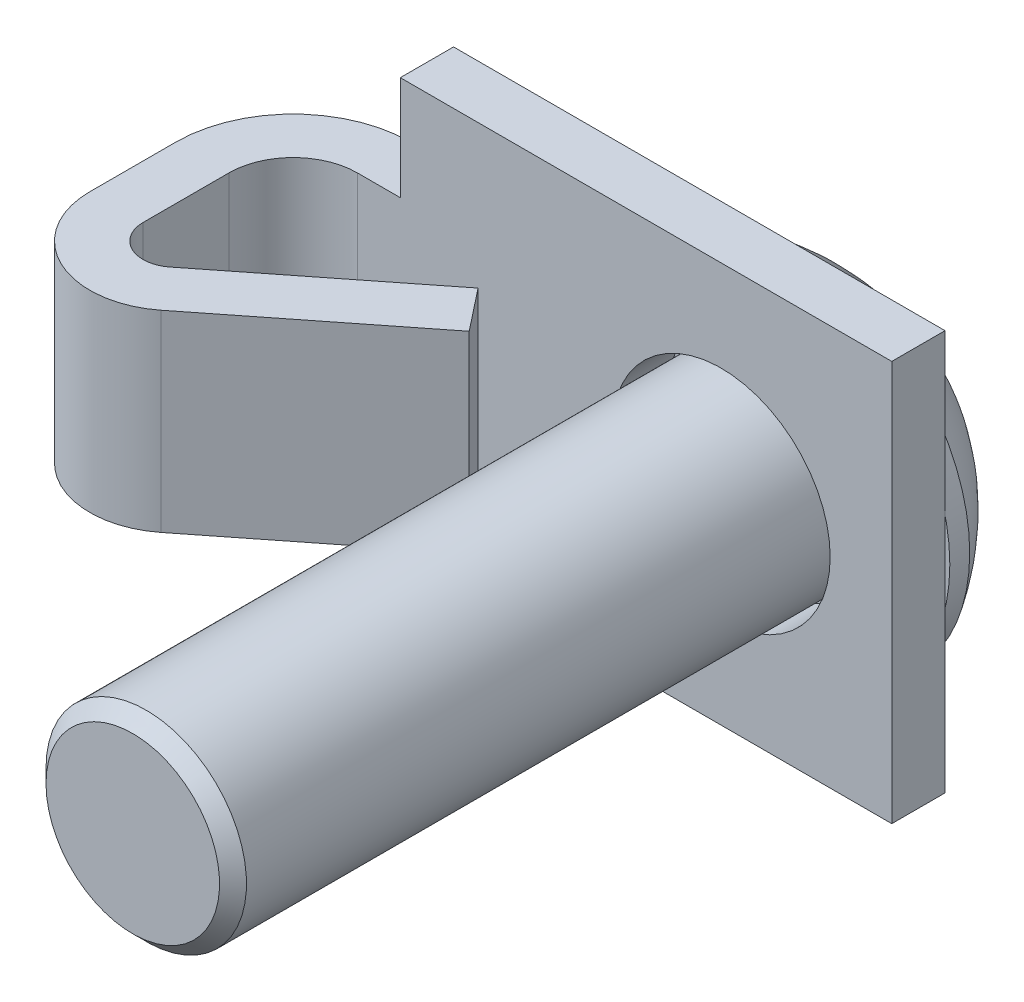
ISO-10303-21;
HEADER;
FILE_DESCRIPTION(('STEP AP214'),'2;1');
FILE_NAME('part.step','',(''),(''),'','','');
FILE_SCHEMA(('AUTOMOTIVE_DESIGN { 1 0 10303 214 1 1 1 1 }'));
ENDSEC;
DATA;
#1=APPLICATION_CONTEXT('core data for automotive mechanical design processes');
#2=APPLICATION_PROTOCOL_DEFINITION('international standard','automotive_design',2000,#1);
#3=PRODUCT_CONTEXT('',#1,'mechanical');
#4=PRODUCT('Part','Part','',(#3));
#5=PRODUCT_RELATED_PRODUCT_CATEGORY('part','',(#4));
#6=PRODUCT_DEFINITION_FORMATION('','',#4);
#7=PRODUCT_DEFINITION_CONTEXT('part definition',#1,'design');
#8=PRODUCT_DEFINITION('design','',#6,#7);
#9=PRODUCT_DEFINITION_SHAPE('','',#8);
#10=(LENGTH_UNIT() NAMED_UNIT(*) SI_UNIT(.MILLI.,.METRE.));
#11=(NAMED_UNIT(*) PLANE_ANGLE_UNIT() SI_UNIT($,.RADIAN.));
#12=(NAMED_UNIT(*) SI_UNIT($,.STERADIAN.) SOLID_ANGLE_UNIT());
#13=UNCERTAINTY_MEASURE_WITH_UNIT(LENGTH_MEASURE(1.E-05),#10,'distance_accuracy_value','');
#14=(GEOMETRIC_REPRESENTATION_CONTEXT(3) GLOBAL_UNCERTAINTY_ASSIGNED_CONTEXT((#13)) GLOBAL_UNIT_ASSIGNED_CONTEXT((#10,
#11,#12)) REPRESENTATION_CONTEXT('',''));
#15=CARTESIAN_POINT('',(0.,0.,0.));
#16=DIRECTION('',(0.,0.,1.));
#17=DIRECTION('',(1.,0.,0.));
#18=AXIS2_PLACEMENT_3D('',#15,#16,#17);
#19=CARTESIAN_POINT('',(-19.9497583249162,11.2575197282908,-2.39884763956345));
#20=DIRECTION('',(0.,1.,0.));
#21=DIRECTION('',(0.,0.,1.));
#22=AXIS2_PLACEMENT_3D('',#19,#20,#21);
#23=CYLINDRICAL_SURFACE('',#22,1.27);
#24=CARTESIAN_POINT('',(-19.9497583249162,11.2575197282908,-2.39884763956345));
#25=DIRECTION('',(0.,1.,0.));
#26=DIRECTION('',(0.,0.,1.));
#27=AXIS2_PLACEMENT_3D('',#24,#25,#26);
#28=CIRCLE('',#27,1.27);
#29=CARTESIAN_POINT('',(-21.2197583249162,11.2575197282908,-2.39884763956345));
#30=VERTEX_POINT('',#29);
#31=CARTESIAN_POINT('',(-19.1634522293389,11.2575197282908,-1.40153990167204));
#32=VERTEX_POINT('',#31);
#33=EDGE_CURVE('P0_E139',#30,#32,#28,.T.);
#34=ORIENTED_EDGE('',*,*,#33,.F.);
#35=DIRECTION('',(0.,-1.,0.));
#36=VECTOR('',#35,1.);
#37=CARTESIAN_POINT('',(-21.2197583249162,18.8775197282907,-2.3988476395634));
#38=LINE('',#37,#36);
#39=CARTESIAN_POINT('',(-21.2197583249162,18.8775197282907,-2.39884763956339));
#40=VERTEX_POINT('',#39);
#41=EDGE_CURVE('P0_E164',#40,#30,#38,.T.);
#42=ORIENTED_EDGE('',*,*,#41,.F.);
#43=CARTESIAN_POINT('',(-19.9497583249162,18.8775197282907,-2.3988476395634));
#44=DIRECTION('',(0.,1.,0.));
#45=DIRECTION('',(0.,0.,1.));
#46=AXIS2_PLACEMENT_3D('',#43,#44,#45);
#47=CIRCLE('',#46,1.27);
#48=CARTESIAN_POINT('',(-19.1634522293389,18.8775197282907,-1.40153990167199));
#49=VERTEX_POINT('',#48);
#50=EDGE_CURVE('P0_E171',#49,#40,#47,.F.);
#51=ORIENTED_EDGE('',*,*,#50,.F.);
#52=DIRECTION('',(0.,1.,0.));
#53=VECTOR('',#52,1.);
#54=CARTESIAN_POINT('',(-19.1634522293389,11.2575197282908,-1.40153990167204));
#55=LINE('',#54,#53);
#56=EDGE_CURVE('P0_E20',#32,#49,#55,.T.);
#57=ORIENTED_EDGE('',*,*,#56,.F.);
#58=EDGE_LOOP('',(#34,#42,#51,#57));
#59=FACE_BOUND('',#58,.T.);
#60=ADVANCED_FACE('P0_F16',(#59),#23,.F.);
#61=CARTESIAN_POINT('',(-19.1634522293389,11.2575197282908,-1.40153990167204));
#62=DIRECTION('',(-0.619138657934842,0.,-0.785281683379055));
#63=DIRECTION('',(0.,1.,0.));
#64=AXIS2_PLACEMENT_3D('',#61,#62,#63);
#65=PLANE('',#64);
#66=DIRECTION('',(0.785281683379055,0.,-0.619138657934842));
#67=VECTOR('',#66,1.);
#68=CARTESIAN_POINT('',(-19.1634522293389,11.2575197282908,-1.40153990167204));
#69=LINE('',#68,#67);
#70=CARTESIAN_POINT('',(-12.3396264435744,11.2575197282908,-6.78164035276085));
#71=VERTEX_POINT('',#70);
#72=EDGE_CURVE('P0_E130',#32,#71,#69,.T.);
#73=ORIENTED_EDGE('',*,*,#72,.F.);
#74=ORIENTED_EDGE('',*,*,#56,.T.);
#75=DIRECTION('',(-0.785281683379055,0.,0.619138657934842));
#76=VECTOR('',#75,1.);
#77=CARTESIAN_POINT('',(-12.3396264435744,18.8775197282908,-6.7816403527608));
#78=LINE('',#77,#76);
#79=CARTESIAN_POINT('',(-12.3396264435744,18.8775197282908,-6.7816403527608));
#80=VERTEX_POINT('',#79);
#81=EDGE_CURVE('P0_E146',#80,#49,#78,.T.);
#82=ORIENTED_EDGE('',*,*,#81,.F.);
#83=DIRECTION('',(0.,-1.,0.));
#84=VECTOR('',#83,1.);
#85=CARTESIAN_POINT('',(-12.3396264435744,18.8775197282908,-6.7816403527608));
#86=LINE('',#85,#84);
#87=EDGE_CURVE('P0_E143',#71,#80,#86,.F.);
#88=ORIENTED_EDGE('',*,*,#87,.F.);
#89=EDGE_LOOP('',(#73,#74,#82,#88));
#90=FACE_BOUND('',#89,.T.);
#91=ADVANCED_FACE('P0_F144',(#90),#65,.T.);
#92=CARTESIAN_POINT('',(-11.0343583249162,18.8775197282908,-5.12610950786104));
#93=DIRECTION('',(0.785281683379066,0.,-0.619138657934828));
#94=DIRECTION('',(0.,-1.,0.));
#95=AXIS2_PLACEMENT_3D('',#92,#93,#94);
#96=PLANE('',#95);
#97=DIRECTION('',(0.619138657934827,0.,0.785281683379066));
#98=VECTOR('',#97,1.);
#99=CARTESIAN_POINT('',(-12.3396264435744,11.2575197282908,-6.78164035276084));
#100=LINE('',#99,#98);
#101=CARTESIAN_POINT('',(-11.0343583249162,11.2575197282908,-5.12610950786109));
#102=VERTEX_POINT('',#101);
#103=EDGE_CURVE('P0_E135',#71,#102,#100,.T.);
#104=ORIENTED_EDGE('',*,*,#103,.F.);
#105=ORIENTED_EDGE('',*,*,#87,.T.);
#106=DIRECTION('',(-0.619138657934828,0.,-0.785281683379066));
#107=VECTOR('',#106,1.);
#108=CARTESIAN_POINT('',(-11.0343583249162,18.8775197282908,-5.12610950786104));
#109=LINE('',#108,#107);
#110=CARTESIAN_POINT('',(-11.0343583249162,18.8775197282908,-5.12610950786104));
#111=VERTEX_POINT('',#110);
#112=EDGE_CURVE('P0_E174',#111,#80,#109,.T.);
#113=ORIENTED_EDGE('',*,*,#112,.F.);
#114=DIRECTION('',(0.,-1.,0.));
#115=VECTOR('',#114,1.);
#116=CARTESIAN_POINT('',(-11.0343583249162,18.8775197282908,-5.12610950786104));
#117=LINE('',#116,#115);
#118=EDGE_CURVE('P0_E150',#102,#111,#117,.F.);
#119=ORIENTED_EDGE('',*,*,#118,.F.);
#120=EDGE_LOOP('',(#104,#105,#113,#119));
#121=FACE_BOUND('',#120,.T.);
#122=ADVANCED_FACE('P0_F151',(#121),#96,.T.);
#123=CARTESIAN_POINT('',(-17.8581841106807,18.8775197282907,0.253990943227745));
#124=DIRECTION('',(0.619138657934841,0.,0.785281683379056));
#125=DIRECTION('',(0.,-1.,0.));
#126=AXIS2_PLACEMENT_3D('',#123,#124,#125);
#127=PLANE('',#126);
#128=DIRECTION('',(-0.785281683379056,0.,0.619138657934841));
#129=VECTOR('',#128,1.);
#130=CARTESIAN_POINT('',(-11.0343583249162,11.2575197282908,-5.12610950786109));
#131=LINE('',#130,#129);
#132=CARTESIAN_POINT('',(-17.8581841106807,11.2575197282908,0.253990943227686));
#133=VERTEX_POINT('',#132);
#134=EDGE_CURVE('P0_E153',#102,#133,#131,.T.);
#135=ORIENTED_EDGE('',*,*,#134,.F.);
#136=ORIENTED_EDGE('',*,*,#118,.T.);
#137=DIRECTION('',(0.785281683379056,0.,-0.619138657934841));
#138=VECTOR('',#137,1.);
#139=CARTESIAN_POINT('',(-17.8581841106807,18.8775197282907,0.253990943227743));
#140=LINE('',#139,#138);
#141=CARTESIAN_POINT('',(-17.8581841106807,18.8775197282907,0.253990943227738));
#142=VERTEX_POINT('',#141);
#143=EDGE_CURVE('P0_E176',#142,#111,#140,.T.);
#144=ORIENTED_EDGE('',*,*,#143,.F.);
#145=DIRECTION('',(0.,-1.,0.));
#146=VECTOR('',#145,1.);
#147=CARTESIAN_POINT('',(-17.8581841106807,18.8775197282907,0.253990943227731));
#148=LINE('',#147,#146);
#149=EDGE_CURVE('P0_E189',#133,#142,#148,.F.);
#150=ORIENTED_EDGE('',*,*,#149,.F.);
#151=EDGE_LOOP('',(#135,#136,#144,#150));
#152=FACE_BOUND('',#151,.T.);
#153=ADVANCED_FACE('P0_F193',(#152),#127,.T.);
#154=CARTESIAN_POINT('',(-19.9497583249162,18.8775197282907,-2.3988476395634));
#155=DIRECTION('',(0.,-1.,0.));
#156=DIRECTION('',(0.,0.,-1.));
#157=AXIS2_PLACEMENT_3D('',#154,#155,#156);
#158=CYLINDRICAL_SURFACE('',#157,3.3782);
#159=CARTESIAN_POINT('',(-19.9497583249162,11.2575197282908,-2.39884763956345));
#160=DIRECTION('',(0.,-1.,0.));
#161=DIRECTION('',(0.,0.,-1.));
#162=AXIS2_PLACEMENT_3D('',#159,#160,#161);
#163=CIRCLE('',#162,3.3782);
#164=CARTESIAN_POINT('',(-23.3279583249162,11.2575197282908,-2.39884763956345));
#165=VERTEX_POINT('',#164);
#166=EDGE_CURVE('P0_E155',#133,#165,#163,.T.);
#167=ORIENTED_EDGE('',*,*,#166,.F.);
#168=ORIENTED_EDGE('',*,*,#149,.T.);
#169=CARTESIAN_POINT('',(-19.9497583249162,18.8775197282907,-2.3988476395634));
#170=DIRECTION('',(0.,-1.,0.));
#171=DIRECTION('',(0.,0.,-1.));
#172=AXIS2_PLACEMENT_3D('',#169,#170,#171);
#173=CIRCLE('',#172,3.3782);
#174=CARTESIAN_POINT('',(-23.3279583249162,18.8775197282907,-2.3988476395634));
#175=VERTEX_POINT('',#174);
#176=EDGE_CURVE('P0_E179',#175,#142,#173,.F.);
#177=ORIENTED_EDGE('',*,*,#176,.F.);
#178=DIRECTION('',(0.,1.,0.));
#179=VECTOR('',#178,1.);
#180=CARTESIAN_POINT('',(-23.3279583249162,11.2575197282908,-2.39884763956345));
#181=LINE('',#180,#179);
#182=EDGE_CURVE('P0_E187',#165,#175,#181,.T.);
#183=ORIENTED_EDGE('',*,*,#182,.F.);
#184=EDGE_LOOP('',(#167,#168,#177,#183));
#185=FACE_BOUND('',#184,.T.);
#186=ADVANCED_FACE('P0_F202',(#185),#158,.T.);
#187=CARTESIAN_POINT('',(-23.3279583249162,11.2575197282908,-2.39884763956345));
#188=DIRECTION('',(-1.,0.,0.));
#189=DIRECTION('',(0.,1.,0.));
#190=AXIS2_PLACEMENT_3D('',#187,#188,#189);
#191=PLANE('',#190);
#192=DIRECTION('',(0.,0.,-1.));
#193=VECTOR('',#192,1.);
#194=CARTESIAN_POINT('',(-23.3279583249162,11.2575197282907,1.14306207603401));
#195=LINE('',#194,#193);
#196=CARTESIAN_POINT('',(-23.3279583249162,11.2575197282908,-5.8024476395635));
#197=VERTEX_POINT('',#196);
#198=EDGE_CURVE('P0_E205',#165,#197,#195,.T.);
#199=ORIENTED_EDGE('',*,*,#198,.F.);
#200=ORIENTED_EDGE('',*,*,#182,.T.);
#201=DIRECTION('',(0.,0.,-1.));
#202=VECTOR('',#201,1.);
#203=CARTESIAN_POINT('',(-23.3279583249162,18.8775197282907,1.0936523604366));
#204=LINE('',#203,#202);
#205=CARTESIAN_POINT('',(-23.3279583249162,18.8775197282908,-5.80244763956345));
#206=VERTEX_POINT('',#205);
#207=EDGE_CURVE('P0_E182',#206,#175,#204,.F.);
#208=ORIENTED_EDGE('',*,*,#207,.F.);
#209=DIRECTION('',(0.,-1.,0.));
#210=VECTOR('',#209,1.);
#211=CARTESIAN_POINT('',(-23.3279583249162,18.8775197282908,-5.80244763956345));
#212=LINE('',#211,#210);
#213=EDGE_CURVE('P0_E216',#197,#206,#212,.F.);
#214=ORIENTED_EDGE('',*,*,#213,.F.);
#215=EDGE_LOOP('',(#199,#200,#208,#214));
#216=FACE_BOUND('',#215,.T.);
#217=ADVANCED_FACE('P0_F352',(#216),#191,.T.);
#218=CARTESIAN_POINT('',(-23.3279583249162,18.8775197282907,1.0936523604366));
#219=DIRECTION('',(0.,1.,0.));
#220=DIRECTION('',(1.,0.,0.));
#221=AXIS2_PLACEMENT_3D('',#218,#219,#220);
#222=PLANE('',#221);
#223=CARTESIAN_POINT('',(-18.6797583249163,18.8775197282908,-5.80244763956345));
#224=DIRECTION('',(0.,1.,0.));
#225=DIRECTION('',(0.,0.,1.));
#226=AXIS2_PLACEMENT_3D('',#223,#224,#225);
#227=CIRCLE('',#226,2.54);
#228=CARTESIAN_POINT('',(-18.6797583249163,18.8775197282908,-8.34244763956344));
#229=VERTEX_POINT('',#228);
#230=CARTESIAN_POINT('',(-21.2197583249163,18.8775197282908,-5.80244763956344));
#231=VERTEX_POINT('',#230);
#232=EDGE_CURVE('P0_E224',#229,#231,#227,.T.);
#233=ORIENTED_EDGE('',*,*,#232,.F.);
#234=DIRECTION('',(1.,0.,0.));
#235=VECTOR('',#234,1.);
#236=CARTESIAN_POINT('',(-23.3279583249162,18.8775197282908,-8.34244763956344));
#237=LINE('',#236,#235);
#238=CARTESIAN_POINT('',(-16.9779583249162,18.8775197282908,-8.34244763956344));
#239=VERTEX_POINT('',#238);
#240=EDGE_CURVE('P0_E169',#229,#239,#237,.T.);
#241=ORIENTED_EDGE('',*,*,#240,.T.);
#242=DIRECTION('',(0.,0.,-1.));
#243=VECTOR('',#242,1.);
#244=CARTESIAN_POINT('',(-16.9779583249162,18.8775197282908,-8.34244763956345));
#245=LINE('',#244,#243);
#246=CARTESIAN_POINT('',(-16.9779583249162,18.8775197282908,-10.4506476395634));
#247=VERTEX_POINT('',#246);
#248=EDGE_CURVE('P0_E221',#247,#239,#245,.F.);
#249=ORIENTED_EDGE('',*,*,#248,.F.);
#250=DIRECTION('',(1.,0.,0.));
#251=VECTOR('',#250,1.);
#252=CARTESIAN_POINT('',(-23.3279583249162,18.8775197282908,-10.4506476395634));
#253=LINE('',#252,#251);
#254=CARTESIAN_POINT('',(-18.6797583249162,18.8775197282908,-10.4506476395634));
#255=VERTEX_POINT('',#254);
#256=EDGE_CURVE('P0_E185',#247,#255,#253,.F.);
#257=ORIENTED_EDGE('',*,*,#256,.T.);
#258=CARTESIAN_POINT('',(-18.6797583249162,18.8775197282908,-5.80244763956345));
#259=DIRECTION('',(0.,-1.,0.));
#260=DIRECTION('',(0.,0.,-1.));
#261=AXIS2_PLACEMENT_3D('',#258,#259,#260);
#262=CIRCLE('',#261,4.6482);
#263=EDGE_CURVE('P0_E210',#206,#255,#262,.T.);
#264=ORIENTED_EDGE('',*,*,#263,.F.);
#265=ORIENTED_EDGE('',*,*,#207,.T.);
#266=ORIENTED_EDGE('',*,*,#176,.T.);
#267=ORIENTED_EDGE('',*,*,#143,.T.);
#268=ORIENTED_EDGE('',*,*,#112,.T.);
#269=ORIENTED_EDGE('',*,*,#81,.T.);
#270=ORIENTED_EDGE('',*,*,#50,.T.);
#271=DIRECTION('',(0.,0.,-1.));
#272=VECTOR('',#271,1.);
#273=CARTESIAN_POINT('',(-21.2197583249162,18.8775197282907,-2.3988476395634));
#274=LINE('',#273,#272);
#275=EDGE_CURVE('P0_E166',#231,#40,#274,.F.);
#276=ORIENTED_EDGE('',*,*,#275,.F.);
#277=EDGE_LOOP('',(#233,#241,#249,#257,#264,#265,#266,#267,#268,#269,#270,#276));
#278=FACE_BOUND('',#277,.T.);
#279=ADVANCED_FACE('P0_F197',(#278),#222,.T.);
#280=CARTESIAN_POINT('',(-21.2197583249162,18.8775197282907,-2.3988476395634));
#281=DIRECTION('',(1.,0.,0.));
#282=DIRECTION('',(0.,-1.,0.));
#283=AXIS2_PLACEMENT_3D('',#280,#281,#282);
#284=PLANE('',#283);
#285=DIRECTION('',(0.,0.,-1.));
#286=VECTOR('',#285,1.);
#287=CARTESIAN_POINT('',(-21.2197583249163,11.2575197282907,1.14306207603401));
#288=LINE('',#287,#286);
#289=CARTESIAN_POINT('',(-21.2197583249163,11.2575197282908,-5.8024476395635));
#290=VERTEX_POINT('',#289);
#291=EDGE_CURVE('P0_E160',#290,#30,#288,.F.);
#292=ORIENTED_EDGE('',*,*,#291,.F.);
#293=DIRECTION('',(0.,1.,0.));
#294=VECTOR('',#293,1.);
#295=CARTESIAN_POINT('',(-21.2197583249163,11.2575197282908,-5.8024476395635));
#296=LINE('',#295,#294);
#297=EDGE_CURVE('P0_E227',#231,#290,#296,.F.);
#298=ORIENTED_EDGE('',*,*,#297,.F.);
#299=ORIENTED_EDGE('',*,*,#275,.T.);
#300=ORIENTED_EDGE('',*,*,#41,.T.);
#301=EDGE_LOOP('',(#292,#298,#299,#300));
#302=FACE_BOUND('',#301,.T.);
#303=ADVANCED_FACE('P0_F306',(#302),#284,.T.);
#304=CARTESIAN_POINT('',(-11.0343583249162,11.2575197282907,1.14306207603401));
#305=DIRECTION('',(0.,-1.,0.));
#306=DIRECTION('',(-1.,0.,0.));
#307=AXIS2_PLACEMENT_3D('',#304,#305,#306);
#308=PLANE('',#307);
#309=CARTESIAN_POINT('',(-18.6797583249162,11.2575197282908,-5.8024476395635));
#310=DIRECTION('',(0.,-1.,0.));
#311=DIRECTION('',(0.,0.,-1.));
#312=AXIS2_PLACEMENT_3D('',#309,#310,#311);
#313=CIRCLE('',#312,4.6482);
#314=CARTESIAN_POINT('',(-18.6797583249162,11.2575197282908,-10.4506476395635));
#315=VERTEX_POINT('',#314);
#316=EDGE_CURVE('P0_E213',#315,#197,#313,.F.);
#317=ORIENTED_EDGE('',*,*,#316,.F.);
#318=DIRECTION('',(-1.,0.,0.));
#319=VECTOR('',#318,1.);
#320=CARTESIAN_POINT('',(-11.0343583249162,11.2575197282908,-10.4506476395635));
#321=LINE('',#320,#319);
#322=CARTESIAN_POINT('',(-16.9779583249162,11.2575197282908,-10.4506476395635));
#323=VERTEX_POINT('',#322);
#324=EDGE_CURVE('P0_E206',#315,#323,#321,.F.);
#325=ORIENTED_EDGE('',*,*,#324,.T.);
#326=DIRECTION('',(0.,0.,-1.));
#327=VECTOR('',#326,1.);
#328=CARTESIAN_POINT('',(-16.9779583249162,11.2575197282908,-8.3424476395635));
#329=LINE('',#328,#327);
#330=CARTESIAN_POINT('',(-16.9779583249162,11.2575197282908,-8.3424476395635));
#331=VERTEX_POINT('',#330);
#332=EDGE_CURVE('P0_E233',#331,#323,#329,.T.);
#333=ORIENTED_EDGE('',*,*,#332,.F.);
#334=DIRECTION('',(-1.,0.,0.));
#335=VECTOR('',#334,1.);
#336=CARTESIAN_POINT('',(-11.0343583249162,11.2575197282908,-8.3424476395635));
#337=LINE('',#336,#335);
#338=CARTESIAN_POINT('',(-18.6797583249163,11.2575197282908,-8.3424476395635));
#339=VERTEX_POINT('',#338);
#340=EDGE_CURVE('P0_E162',#331,#339,#337,.T.);
#341=ORIENTED_EDGE('',*,*,#340,.T.);
#342=CARTESIAN_POINT('',(-18.6797583249163,11.2575197282908,-5.8024476395635));
#343=DIRECTION('',(0.,1.,0.));
#344=DIRECTION('',(0.,0.,1.));
#345=AXIS2_PLACEMENT_3D('',#342,#343,#344);
#346=CIRCLE('',#345,2.54);
#347=EDGE_CURVE('P0_E230',#290,#339,#346,.F.);
#348=ORIENTED_EDGE('',*,*,#347,.F.);
#349=ORIENTED_EDGE('',*,*,#291,.T.);
#350=ORIENTED_EDGE('',*,*,#33,.T.);
#351=ORIENTED_EDGE('',*,*,#72,.T.);
#352=ORIENTED_EDGE('',*,*,#103,.T.);
#353=ORIENTED_EDGE('',*,*,#134,.T.);
#354=ORIENTED_EDGE('',*,*,#166,.T.);
#355=ORIENTED_EDGE('',*,*,#198,.T.);
#356=EDGE_LOOP('',(#317,#325,#333,#341,#348,#349,#350,#351,#352,#353,#354,#355));
#357=FACE_BOUND('',#356,.T.);
#358=ADVANCED_FACE('P0_F133',(#357),#308,.T.);
#359=CARTESIAN_POINT('',(-18.6797583249162,18.8775197282908,-5.80244763956345));
#360=DIRECTION('',(0.,-1.,0.));
#361=DIRECTION('',(0.,0.,-1.));
#362=AXIS2_PLACEMENT_3D('',#359,#360,#361);
#363=CYLINDRICAL_SURFACE('',#362,4.6482);
#364=ORIENTED_EDGE('',*,*,#316,.T.);
#365=ORIENTED_EDGE('',*,*,#213,.T.);
#366=ORIENTED_EDGE('',*,*,#263,.T.);
#367=DIRECTION('',(0.,1.,0.));
#368=VECTOR('',#367,1.);
#369=CARTESIAN_POINT('',(-18.6797583249162,7.1427197282908,-10.4506476395635));
#370=LINE('',#369,#368);
#371=EDGE_CURVE('P0_E248',#315,#255,#370,.T.);
#372=ORIENTED_EDGE('',*,*,#371,.F.);
#373=EDGE_LOOP('',(#364,#365,#366,#372));
#374=FACE_BOUND('',#373,.T.);
#375=ADVANCED_FACE('P0_F342',(#374),#363,.T.);
#376=CARTESIAN_POINT('',(-16.9779583249162,22.9923197282908,-10.4506476395634));
#377=DIRECTION('',(0.,1.,0.));
#378=DIRECTION('',(0.,0.,1.));
#379=AXIS2_PLACEMENT_3D('',#376,#377,#378);
#380=PLANE('',#379);
#381=DIRECTION('',(0.,0.,1.));
#382=VECTOR('',#381,1.);
#383=CARTESIAN_POINT('',(2.47844167508382,22.9923197282908,-8.34244763956341));
#384=LINE('',#383,#382);
#385=CARTESIAN_POINT('',(2.47844167508382,22.9923197282908,-10.4506476395634));
#386=VERTEX_POINT('',#385);
#387=CARTESIAN_POINT('',(2.47844167508382,22.9923197282908,-8.34244763956341));
#388=VERTEX_POINT('',#387);
#389=EDGE_CURVE('P0_E33',#386,#388,#384,.T.);
#390=ORIENTED_EDGE('',*,*,#389,.F.);
#391=DIRECTION('',(1.,0.,0.));
#392=VECTOR('',#391,1.);
#393=CARTESIAN_POINT('',(-18.6797583249162,22.9923197282908,-10.4506476395634));
#394=LINE('',#393,#392);
#395=CARTESIAN_POINT('',(-16.9779583249162,22.9923197282908,-10.4506476395634));
#396=VERTEX_POINT('',#395);
#397=EDGE_CURVE('P0_E240',#396,#386,#394,.T.);
#398=ORIENTED_EDGE('',*,*,#397,.F.);
#399=DIRECTION('',(0.,0.,-1.));
#400=VECTOR('',#399,1.);
#401=CARTESIAN_POINT('',(-16.9779583249162,22.9923197282908,-8.34244763956342));
#402=LINE('',#401,#400);
#403=CARTESIAN_POINT('',(-16.9779583249162,22.9923197282908,-8.34244763956341));
#404=VERTEX_POINT('',#403);
#405=EDGE_CURVE('P0_E219',#404,#396,#402,.T.);
#406=ORIENTED_EDGE('',*,*,#405,.F.);
#407=DIRECTION('',(1.,0.,0.));
#408=VECTOR('',#407,1.);
#409=CARTESIAN_POINT('',(-18.6797583249163,22.9923197282908,-8.34244763956341));
#410=LINE('',#409,#408);
#411=EDGE_CURVE('P0_E251',#388,#404,#410,.F.);
#412=ORIENTED_EDGE('',*,*,#411,.F.);
#413=EDGE_LOOP('',(#390,#398,#406,#412));
#414=FACE_BOUND('',#413,.T.);
#415=ADVANCED_FACE('P0_F293',(#414),#380,.T.);
#416=CARTESIAN_POINT('',(-16.9779583249162,22.9923197282908,-8.34244763956342));
#417=DIRECTION('',(-1.,0.,0.));
#418=DIRECTION('',(0.,0.,-1.));
#419=AXIS2_PLACEMENT_3D('',#416,#417,#418);
#420=PLANE('',#419);
#421=ORIENTED_EDGE('',*,*,#248,.T.);
#422=DIRECTION('',(0.,-1.,0.));
#423=VECTOR('',#422,1.);
#424=CARTESIAN_POINT('',(-16.9779583249162,22.9923197282908,-8.34244763956341));
#425=LINE('',#424,#423);
#426=EDGE_CURVE('P0_E253',#404,#239,#425,.T.);
#427=ORIENTED_EDGE('',*,*,#426,.F.);
#428=ORIENTED_EDGE('',*,*,#405,.T.);
#429=DIRECTION('',(0.,1.,0.));
#430=VECTOR('',#429,1.);
#431=CARTESIAN_POINT('',(-16.9779583249162,7.1427197282908,-10.4506476395635));
#432=LINE('',#431,#430);
#433=EDGE_CURVE('P0_E237',#247,#396,#432,.T.);
#434=ORIENTED_EDGE('',*,*,#433,.F.);
#435=EDGE_LOOP('',(#421,#427,#428,#434));
#436=FACE_BOUND('',#435,.T.);
#437=ADVANCED_FACE('P0_F297',(#436),#420,.T.);
#438=CARTESIAN_POINT('',(-18.6797583249163,11.2575197282908,-5.8024476395635));
#439=DIRECTION('',(0.,1.,0.));
#440=DIRECTION('',(0.,0.,1.));
#441=AXIS2_PLACEMENT_3D('',#438,#439,#440);
#442=CYLINDRICAL_SURFACE('',#441,2.54);
#443=ORIENTED_EDGE('',*,*,#347,.T.);
#444=DIRECTION('',(0.,-1.,0.));
#445=VECTOR('',#444,1.);
#446=CARTESIAN_POINT('',(-18.6797583249163,22.9923197282908,-8.34244763956341));
#447=LINE('',#446,#445);
#448=EDGE_CURVE('P0_E256',#229,#339,#447,.T.);
#449=ORIENTED_EDGE('',*,*,#448,.F.);
#450=ORIENTED_EDGE('',*,*,#232,.T.);
#451=ORIENTED_EDGE('',*,*,#297,.T.);
#452=EDGE_LOOP('',(#443,#449,#450,#451));
#453=FACE_BOUND('',#452,.T.);
#454=ADVANCED_FACE('P0_F303',(#453),#442,.F.);
#455=CARTESIAN_POINT('',(-16.9779583249162,11.2575197282908,-8.3424476395635));
#456=DIRECTION('',(-1.,0.,0.));
#457=DIRECTION('',(0.,0.,-1.));
#458=AXIS2_PLACEMENT_3D('',#455,#456,#457);
#459=PLANE('',#458);
#460=DIRECTION('',(0.,0.,-1.));
#461=VECTOR('',#460,1.);
#462=CARTESIAN_POINT('',(-16.9779583249162,7.14271972829079,-8.34244763956353));
#463=LINE('',#462,#461);
#464=CARTESIAN_POINT('',(-16.9779583249162,7.14271972829079,-8.34244763956353));
#465=VERTEX_POINT('',#464);
#466=CARTESIAN_POINT('',(-16.9779583249162,7.1427197282908,-10.4506476395635));
#467=VERTEX_POINT('',#466);
#468=EDGE_CURVE('P0_E42',#465,#467,#463,.T.);
#469=ORIENTED_EDGE('',*,*,#468,.F.);
#470=DIRECTION('',(0.,-1.,0.));
#471=VECTOR('',#470,1.);
#472=CARTESIAN_POINT('',(-16.9779583249162,22.9923197282908,-8.34244763956341));
#473=LINE('',#472,#471);
#474=EDGE_CURVE('P0_E259',#331,#465,#473,.T.);
#475=ORIENTED_EDGE('',*,*,#474,.F.);
#476=ORIENTED_EDGE('',*,*,#332,.T.);
#477=DIRECTION('',(0.,1.,0.));
#478=VECTOR('',#477,1.);
#479=CARTESIAN_POINT('',(-16.9779583249162,7.1427197282908,-10.4506476395635));
#480=LINE('',#479,#478);
#481=EDGE_CURVE('P0_E245',#467,#323,#480,.T.);
#482=ORIENTED_EDGE('',*,*,#481,.F.);
#483=EDGE_LOOP('',(#469,#475,#476,#482));
#484=FACE_BOUND('',#483,.T.);
#485=ADVANCED_FACE('P0_F285',(#484),#459,.T.);
#486=CARTESIAN_POINT('',(-16.9779583249162,7.14271972829079,-8.34244763956353));
#487=DIRECTION('',(0.,-1.,0.));
#488=DIRECTION('',(0.,0.,-1.));
#489=AXIS2_PLACEMENT_3D('',#486,#487,#488);
#490=PLANE('',#489);
#491=DIRECTION('',(0.,0.,1.));
#492=VECTOR('',#491,1.);
#493=CARTESIAN_POINT('',(2.47844167508382,7.14271972829077,-8.34244763956352));
#494=LINE('',#493,#492);
#495=CARTESIAN_POINT('',(2.47844167508382,7.14271972829079,-10.4506476395635));
#496=VERTEX_POINT('',#495);
#497=CARTESIAN_POINT('',(2.47844167508382,7.14271972829077,-8.34244763956352));
#498=VERTEX_POINT('',#497);
#499=EDGE_CURVE('P0_E270',#496,#498,#494,.T.);
#500=ORIENTED_EDGE('',*,*,#499,.T.);
#501=DIRECTION('',(1.,0.,0.));
#502=VECTOR('',#501,1.);
#503=CARTESIAN_POINT('',(-18.6797583249163,7.14271972829079,-8.34244763956353));
#504=LINE('',#503,#502);
#505=EDGE_CURVE('P0_E262',#465,#498,#504,.T.);
#506=ORIENTED_EDGE('',*,*,#505,.F.);
#507=ORIENTED_EDGE('',*,*,#468,.T.);
#508=DIRECTION('',(1.,0.,0.));
#509=VECTOR('',#508,1.);
#510=CARTESIAN_POINT('',(-18.6797583249162,7.1427197282908,-10.4506476395635));
#511=LINE('',#510,#509);
#512=EDGE_CURVE('P0_E243',#496,#467,#511,.F.);
#513=ORIENTED_EDGE('',*,*,#512,.F.);
#514=EDGE_LOOP('',(#500,#506,#507,#513));
#515=FACE_BOUND('',#514,.T.);
#516=ADVANCED_FACE('P0_F277',(#515),#490,.T.);
#517=CARTESIAN_POINT('',(-18.6797583249162,7.1427197282908,-10.4506476395635));
#518=DIRECTION('',(0.,0.,-1.));
#519=DIRECTION('',(0.,1.,0.));
#520=AXIS2_PLACEMENT_3D('',#517,#518,#519);
#521=PLANE('',#520);
#522=DIRECTION('',(0.,1.,0.));
#523=VECTOR('',#522,1.);
#524=CARTESIAN_POINT('',(2.47844167508382,7.14271972829079,-10.4506476395635));
#525=LINE('',#524,#523);
#526=EDGE_CURVE('P0_E267',#496,#386,#525,.T.);
#527=ORIENTED_EDGE('',*,*,#526,.F.);
#528=ORIENTED_EDGE('',*,*,#512,.T.);
#529=ORIENTED_EDGE('',*,*,#481,.T.);
#530=ORIENTED_EDGE('',*,*,#324,.F.);
#531=ORIENTED_EDGE('',*,*,#371,.T.);
#532=ORIENTED_EDGE('',*,*,#256,.F.);
#533=ORIENTED_EDGE('',*,*,#433,.T.);
#534=ORIENTED_EDGE('',*,*,#397,.T.);
#535=EDGE_LOOP('',(#527,#528,#529,#530,#531,#532,#533,#534));
#536=FACE_BOUND('',#535,.T.);
#537=CARTESIAN_POINT('',(-4.27795832491617,15.0675197282908,-10.4506476395635));
#538=DIRECTION('',(0.,0.,-1.));
#539=DIRECTION('',(1.,0.,0.));
#540=AXIS2_PLACEMENT_3D('',#537,#538,#539);
#541=CIRCLE('',#540,4.318);
#542=CARTESIAN_POINT('',(0.0400416750838276,15.0675197282908,-10.4506476395635));
#543=VERTEX_POINT('',#542);
#544=EDGE_CURVE('P0_E25',#543,#543,#541,.T.);
#545=ORIENTED_EDGE('',*,*,#544,.F.);
#546=EDGE_LOOP('',(#545));
#547=FACE_BOUND('',#546,.T.);
#548=ADVANCED_FACE('P0_F287',(#536,#547),#521,.T.);
#549=CARTESIAN_POINT('',(-18.6797583249163,22.9923197282908,-8.34244763956341));
#550=DIRECTION('',(0.,0.,1.));
#551=DIRECTION('',(0.,-1.,0.));
#552=AXIS2_PLACEMENT_3D('',#549,#550,#551);
#553=PLANE('',#552);
#554=DIRECTION('',(0.,1.,0.));
#555=VECTOR('',#554,1.);
#556=CARTESIAN_POINT('',(2.47844167508382,7.14271972829077,-8.34244763956352));
#557=LINE('',#556,#555);
#558=EDGE_CURVE('P0_E269',#498,#388,#557,.T.);
#559=ORIENTED_EDGE('',*,*,#558,.T.);
#560=ORIENTED_EDGE('',*,*,#411,.T.);
#561=ORIENTED_EDGE('',*,*,#426,.T.);
#562=ORIENTED_EDGE('',*,*,#240,.F.);
#563=ORIENTED_EDGE('',*,*,#448,.T.);
#564=ORIENTED_EDGE('',*,*,#340,.F.);
#565=ORIENTED_EDGE('',*,*,#474,.T.);
#566=ORIENTED_EDGE('',*,*,#505,.T.);
#567=EDGE_LOOP('',(#559,#560,#561,#562,#563,#564,#565,#566));
#568=FACE_BOUND('',#567,.T.);
#569=CARTESIAN_POINT('',(-4.27795832491617,15.0675197282908,-8.34244763956347));
#570=DIRECTION('',(0.,0.,-1.));
#571=DIRECTION('',(1.,0.,0.));
#572=AXIS2_PLACEMENT_3D('',#569,#570,#571);
#573=CIRCLE('',#572,4.318);
#574=CARTESIAN_POINT('',(0.0400416750838276,15.0675197282908,-8.34244763956347));
#575=VERTEX_POINT('',#574);
#576=EDGE_CURVE('P0_E11',#575,#575,#573,.F.);
#577=ORIENTED_EDGE('',*,*,#576,.F.);
#578=EDGE_LOOP('',(#577));
#579=FACE_BOUND('',#578,.T.);
#580=ADVANCED_FACE('P0_F281',(#568,#579),#553,.T.);
#581=CARTESIAN_POINT('',(-4.27795832491617,15.0675197282908,-8.34244763956347));
#582=DIRECTION('',(0.,0.,-1.));
#583=DIRECTION('',(1.,0.,0.));
#584=AXIS2_PLACEMENT_3D('',#581,#582,#583);
#585=CYLINDRICAL_SURFACE('',#584,4.318);
#586=ORIENTED_EDGE('',*,*,#544,.T.);
#587=EDGE_LOOP('',(#586));
#588=FACE_BOUND('',#587,.T.);
#589=ORIENTED_EDGE('',*,*,#576,.T.);
#590=EDGE_LOOP('',(#589));
#591=FACE_BOUND('',#590,.T.);
#592=ADVANCED_FACE('P0_F18',(#588,#591),#585,.F.);
#593=CARTESIAN_POINT('',(2.47844167508382,7.14271972829077,-8.34244763956352));
#594=DIRECTION('',(-1.,0.,0.));
#595=DIRECTION('',(0.,0.,1.));
#596=AXIS2_PLACEMENT_3D('',#593,#594,#595);
#597=PLANE('',#596);
#598=ORIENTED_EDGE('',*,*,#389,.T.);
#599=ORIENTED_EDGE('',*,*,#558,.F.);
#600=ORIENTED_EDGE('',*,*,#499,.F.);
#601=ORIENTED_EDGE('',*,*,#526,.T.);
#602=EDGE_LOOP('',(#598,#599,#600,#601));
#603=FACE_BOUND('',#602,.T.);
#604=ADVANCED_FACE('P0_F291',(#603),#597,.F.);
#605=CLOSED_SHELL('',(#60,#91,#122,#153,#186,#217,#279,#303,#358,#375,#415,#437,#454,#485,#516,
#548,#580,#592,#604));
#606=MANIFOLD_SOLID_BREP('P0_B1',#605);
#607=CARTESIAN_POINT('',(-1.10295832491614,15.0675197282908,-14.6670476395636));
#608=DIRECTION('',(0.,0.,1.));
#609=DIRECTION('',(1.,0.,0.));
#610=AXIS2_PLACEMENT_3D('',#607,#608,#609);
#611=PLANE('',#610);
#612=DIRECTION('',(0.5,0.866025403784439,0.));
#613=VECTOR('',#612,1.);
#614=CARTESIAN_POINT('',(-7.02758898193174,15.0675197282908,-14.6670476395636));
#615=LINE('',#614,#613);
#616=CARTESIAN_POINT('',(-7.02758898193174,15.0675197282908,-14.6670476395636));
#617=VERTEX_POINT('',#616);
#618=CARTESIAN_POINT('',(-5.65277365342394,17.4487697282908,-14.6670476395636));
#619=VERTEX_POINT('',#618);
#620=EDGE_CURVE('P1_E105',#617,#619,#615,.T.);
#621=ORIENTED_EDGE('',*,*,#620,.F.);
#622=DIRECTION('',(-0.5,0.866025403784439,0.));
#623=VECTOR('',#622,1.);
#624=CARTESIAN_POINT('',(-5.65277365342394,12.6862697282908,-14.6670476395636));
#625=LINE('',#624,#623);
#626=CARTESIAN_POINT('',(-5.65277365342394,12.6862697282908,-14.6670476395636));
#627=VERTEX_POINT('',#626);
#628=EDGE_CURVE('P1_E31',#627,#617,#625,.T.);
#629=ORIENTED_EDGE('',*,*,#628,.F.);
#630=DIRECTION('',(-1.,0.,0.));
#631=VECTOR('',#630,1.);
#632=CARTESIAN_POINT('',(-2.90314299640835,12.6862697282908,-14.6670476395636));
#633=LINE('',#632,#631);
#634=CARTESIAN_POINT('',(-2.90314299640835,12.6862697282908,-14.6670476395636));
#635=VERTEX_POINT('',#634);
#636=EDGE_CURVE('P1_E114',#635,#627,#633,.T.);
#637=ORIENTED_EDGE('',*,*,#636,.F.);
#638=DIRECTION('',(-0.5,-0.866025403784439,0.));
#639=VECTOR('',#638,1.);
#640=CARTESIAN_POINT('',(-1.52832766790055,15.0675197282908,-14.6670476395636));
#641=LINE('',#640,#639);
#642=CARTESIAN_POINT('',(-1.52832766790055,15.0675197282908,-14.6670476395636));
#643=VERTEX_POINT('',#642);
#644=EDGE_CURVE('P1_E112',#643,#635,#641,.T.);
#645=ORIENTED_EDGE('',*,*,#644,.F.);
#646=DIRECTION('',(0.5,-0.866025403784439,0.));
#647=VECTOR('',#646,1.);
#648=CARTESIAN_POINT('',(-2.90314299640835,17.4487697282908,-14.6670476395636));
#649=LINE('',#648,#647);
#650=CARTESIAN_POINT('',(-2.90314299640835,17.4487697282908,-14.6670476395636));
#651=VERTEX_POINT('',#650);
#652=EDGE_CURVE('P1_E79',#651,#643,#649,.T.);
#653=ORIENTED_EDGE('',*,*,#652,.F.);
#654=DIRECTION('',(1.,0.,0.));
#655=VECTOR('',#654,1.);
#656=CARTESIAN_POINT('',(-5.65277365342394,17.4487697282908,-14.6670476395636));
#657=LINE('',#656,#655);
#658=EDGE_CURVE('P1_E108',#619,#651,#657,.T.);
#659=ORIENTED_EDGE('',*,*,#658,.F.);
#660=EDGE_LOOP('',(#621,#629,#637,#645,#653,#659));
#661=FACE_BOUND('',#660,.T.);
#662=CARTESIAN_POINT('',(-4.27795832491614,15.0675197282908,-14.6670476395636));
#663=DIRECTION('',(0.,0.,-1.));
#664=DIRECTION('',(-1.,0.,0.));
#665=AXIS2_PLACEMENT_3D('',#662,#663,#664);
#666=CIRCLE('',#665,3.175);
#667=CARTESIAN_POINT('',(-7.45295832491615,15.0675197282908,-14.6670476395636));
#668=VERTEX_POINT('',#667);
#669=EDGE_CURVE('P1_E118',#668,#668,#666,.T.);
#670=ORIENTED_EDGE('',*,*,#669,.T.);
#671=EDGE_LOOP('',(#670));
#672=FACE_BOUND('',#671,.T.);
#673=ADVANCED_FACE('P1_F16',(#661,#672),#611,.F.);
#674=CARTESIAN_POINT('',(-4.27795832491614,15.0675197282908,14.9493523604364));
#675=DIRECTION('',(0.,0.,-1.));
#676=DIRECTION('',(-1.,0.,0.));
#677=AXIS2_PLACEMENT_3D('',#674,#675,#676);
#678=PLANE('',#677);
#679=CARTESIAN_POINT('',(-4.27795832491614,15.0675197282908,14.9493523604364));
#680=DIRECTION('',(0.,0.,-1.));
#681=DIRECTION('',(-1.,0.,0.));
#682=AXIS2_PLACEMENT_3D('',#679,#680,#681);
#683=CIRCLE('',#682,3.43535);
#684=CARTESIAN_POINT('',(-7.71330832491614,15.0675197282908,14.9493523604364));
#685=VERTEX_POINT('',#684);
#686=EDGE_CURVE('P1_E11',#685,#685,#683,.F.);
#687=ORIENTED_EDGE('',*,*,#686,.T.);
#688=EDGE_LOOP('',(#687));
#689=FACE_BOUND('',#688,.T.);
#690=ADVANCED_FACE('P1_F150',(#689),#678,.F.);
#691=CARTESIAN_POINT('',(-4.27795832491614,15.0675197282908,-10.4506476395636));
#692=DIRECTION('',(0.,0.,-1.));
#693=DIRECTION('',(-1.,0.,0.));
#694=AXIS2_PLACEMENT_3D('',#691,#692,#693);
#695=CYLINDRICAL_SURFACE('',#694,3.96875);
#696=CARTESIAN_POINT('',(-4.27795832491614,15.0675197282908,14.4159523604364));
#697=DIRECTION('',(0.,0.,-1.));
#698=DIRECTION('',(-1.,0.,0.));
#699=AXIS2_PLACEMENT_3D('',#696,#697,#698);
#700=CIRCLE('',#699,3.96875);
#701=CARTESIAN_POINT('',(-8.24670832491614,15.0675197282908,14.4159523604364));
#702=VERTEX_POINT('',#701);
#703=EDGE_CURVE('P1_E24',#702,#702,#700,.T.);
#704=ORIENTED_EDGE('',*,*,#703,.T.);
#705=EDGE_LOOP('',(#704));
#706=FACE_BOUND('',#705,.T.);
#707=CARTESIAN_POINT('',(-4.27795832491614,15.0675197282908,-10.4506476395636));
#708=DIRECTION('',(0.,0.,-1.));
#709=DIRECTION('',(-1.,0.,0.));
#710=AXIS2_PLACEMENT_3D('',#707,#708,#709);
#711=CIRCLE('',#710,3.96875);
#712=CARTESIAN_POINT('',(-8.24670832491615,15.0675197282908,-10.4506476395636));
#713=VERTEX_POINT('',#712);
#714=EDGE_CURVE('P1_E132',#713,#713,#711,.T.);
#715=ORIENTED_EDGE('',*,*,#714,.F.);
#716=EDGE_LOOP('',(#715));
#717=FACE_BOUND('',#716,.T.);
#718=ADVANCED_FACE('P1_F137',(#706,#717),#695,.T.);
#719=CARTESIAN_POINT('',(-0.309208324916141,15.0675197282908,-10.4506476395636));
#720=DIRECTION('',(0.,0.,-1.));
#721=DIRECTION('',(-1.,0.,0.));
#722=AXIS2_PLACEMENT_3D('',#719,#720,#721);
#723=PLANE('',#722);
#724=CARTESIAN_POINT('',(-4.27795832491614,15.0675197282908,-10.4506476395636));
#725=DIRECTION('',(0.,0.,-1.));
#726=DIRECTION('',(-1.,0.,0.));
#727=AXIS2_PLACEMENT_3D('',#724,#725,#726);
#728=CIRCLE('',#727,6.9469);
#729=CARTESIAN_POINT('',(-11.2248583249161,15.0675197282908,-10.4506476395636));
#730=VERTEX_POINT('',#729);
#731=EDGE_CURVE('P1_E129',#730,#730,#728,.T.);
#732=ORIENTED_EDGE('',*,*,#731,.F.);
#733=EDGE_LOOP('',(#732));
#734=FACE_BOUND('',#733,.T.);
#735=ORIENTED_EDGE('',*,*,#714,.T.);
#736=EDGE_LOOP('',(#735));
#737=FACE_BOUND('',#736,.T.);
#738=ADVANCED_FACE('P1_F162',(#734,#737),#723,.F.);
#739=CARTESIAN_POINT('',(-4.27795832491614,15.0675197282908,-10.4506476395636));
#740=DIRECTION('',(0.,0.,-1.));
#741=DIRECTION('',(-1.,0.,0.));
#742=AXIS2_PLACEMENT_3D('',#739,#740,#741);
#743=CYLINDRICAL_SURFACE('',#742,6.9469);
#744=CARTESIAN_POINT('',(-4.27795832491614,15.0675197282908,-11.2380476395636));
#745=DIRECTION('',(0.,0.,-1.));
#746=DIRECTION('',(-1.,0.,0.));
#747=AXIS2_PLACEMENT_3D('',#744,#745,#746);
#748=CIRCLE('',#747,6.9469);
#749=CARTESIAN_POINT('',(-11.2248583249161,15.0675197282908,-11.2380476395636));
#750=VERTEX_POINT('',#749);
#751=EDGE_CURVE('P1_E126',#750,#750,#748,.T.);
#752=ORIENTED_EDGE('',*,*,#751,.F.);
#753=EDGE_LOOP('',(#752));
#754=FACE_BOUND('',#753,.T.);
#755=ORIENTED_EDGE('',*,*,#731,.T.);
#756=EDGE_LOOP('',(#755));
#757=FACE_BOUND('',#756,.T.);
#758=ADVANCED_FACE('P1_F165',(#754,#757),#743,.T.);
#759=CARTESIAN_POINT('',(-4.27795832491614,15.0675197282908,-6.16163469703699));
#760=DIRECTION('',(0.,0.,-1.));
#761=DIRECTION('',(-1.,0.,0.));
#762=AXIS2_PLACEMENT_3D('',#759,#760,#761);
#763=DEGENERATE_TOROIDAL_SURFACE('',#762,1.11260722047872,9.525,.F.);
#764=ORIENTED_EDGE('',*,*,#669,.F.);
#765=EDGE_LOOP('',(#764));
#766=FACE_BOUND('',#765,.T.);
#767=ORIENTED_EDGE('',*,*,#751,.T.);
#768=EDGE_LOOP('',(#767));
#769=FACE_BOUND('',#768,.T.);
#770=ADVANCED_FACE('P1_F169',(#766,#769),#763,.F.);
#771=CARTESIAN_POINT('',(-5.65277365342394,12.6862697282908,-11.4920476395636));
#772=DIRECTION('',(-0.866025403784439,-0.5,0.));
#773=DIRECTION('',(0.5,-0.866025403784439,0.));
#774=AXIS2_PLACEMENT_3D('',#771,#772,#773);
#775=PLANE('',#774);
#776=ORIENTED_EDGE('',*,*,#628,.T.);
#777=DIRECTION('',(0.,0.,-1.));
#778=VECTOR('',#777,1.);
#779=CARTESIAN_POINT('',(-7.02758898193174,15.0675197282908,-11.4920476395636));
#780=LINE('',#779,#778);
#781=CARTESIAN_POINT('',(-7.02758898193174,15.0675197282908,-11.4920476395636));
#782=VERTEX_POINT('',#781);
#783=EDGE_CURVE('P1_E61',#782,#617,#780,.T.);
#784=ORIENTED_EDGE('',*,*,#783,.F.);
#785=DIRECTION('',(-0.5,0.866025403784439,0.));
#786=VECTOR('',#785,1.);
#787=CARTESIAN_POINT('',(-5.65277365342394,12.6862697282908,-11.4920476395636));
#788=LINE('',#787,#786);
#789=CARTESIAN_POINT('',(-5.65277365342394,12.6862697282908,-11.4920476395636));
#790=VERTEX_POINT('',#789);
#791=EDGE_CURVE('P1_E116',#790,#782,#788,.T.);
#792=ORIENTED_EDGE('',*,*,#791,.F.);
#793=DIRECTION('',(0.,0.,-1.));
#794=VECTOR('',#793,1.);
#795=CARTESIAN_POINT('',(-5.65277365342394,12.6862697282908,-11.4920476395636));
#796=LINE('',#795,#794);
#797=EDGE_CURVE('P1_E39',#790,#627,#796,.T.);
#798=ORIENTED_EDGE('',*,*,#797,.T.);
#799=EDGE_LOOP('',(#776,#784,#792,#798));
#800=FACE_BOUND('',#799,.T.);
#801=ADVANCED_FACE('P1_F173',(#800),#775,.F.);
#802=CARTESIAN_POINT('',(-2.90314299640835,12.6862697282908,-11.4920476395636));
#803=DIRECTION('',(0.,-1.,0.));
#804=DIRECTION('',(0.,0.,-1.));
#805=AXIS2_PLACEMENT_3D('',#802,#803,#804);
#806=PLANE('',#805);
#807=ORIENTED_EDGE('',*,*,#636,.T.);
#808=ORIENTED_EDGE('',*,*,#797,.F.);
#809=DIRECTION('',(-1.,0.,0.));
#810=VECTOR('',#809,1.);
#811=CARTESIAN_POINT('',(-2.90314299640835,12.6862697282908,-11.4920476395636));
#812=LINE('',#811,#810);
#813=CARTESIAN_POINT('',(-2.90314299640835,12.6862697282908,-11.4920476395636));
#814=VERTEX_POINT('',#813);
#815=EDGE_CURVE('P1_E91',#814,#790,#812,.T.);
#816=ORIENTED_EDGE('',*,*,#815,.F.);
#817=DIRECTION('',(0.,0.,-1.));
#818=VECTOR('',#817,1.);
#819=CARTESIAN_POINT('',(-2.90314299640835,12.6862697282908,-11.4920476395636));
#820=LINE('',#819,#818);
#821=EDGE_CURVE('P1_E83',#814,#635,#820,.T.);
#822=ORIENTED_EDGE('',*,*,#821,.T.);
#823=EDGE_LOOP('',(#807,#808,#816,#822));
#824=FACE_BOUND('',#823,.T.);
#825=ADVANCED_FACE('P1_F177',(#824),#806,.F.);
#826=CARTESIAN_POINT('',(-1.52832766790055,15.0675197282908,-11.4920476395636));
#827=DIRECTION('',(0.866025403784439,-0.5,0.));
#828=DIRECTION('',(0.5,0.866025403784439,0.));
#829=AXIS2_PLACEMENT_3D('',#826,#827,#828);
#830=PLANE('',#829);
#831=ORIENTED_EDGE('',*,*,#644,.T.);
#832=ORIENTED_EDGE('',*,*,#821,.F.);
#833=DIRECTION('',(-0.5,-0.866025403784439,0.));
#834=VECTOR('',#833,1.);
#835=CARTESIAN_POINT('',(-1.52832766790055,15.0675197282908,-11.4920476395636));
#836=LINE('',#835,#834);
#837=CARTESIAN_POINT('',(-1.52832766790055,15.0675197282908,-11.4920476395636));
#838=VERTEX_POINT('',#837);
#839=EDGE_CURVE('P1_E87',#838,#814,#836,.T.);
#840=ORIENTED_EDGE('',*,*,#839,.F.);
#841=DIRECTION('',(0.,0.,-1.));
#842=VECTOR('',#841,1.);
#843=CARTESIAN_POINT('',(-1.52832766790055,15.0675197282908,-11.4920476395636));
#844=LINE('',#843,#842);
#845=EDGE_CURVE('P1_E72',#838,#643,#844,.T.);
#846=ORIENTED_EDGE('',*,*,#845,.T.);
#847=EDGE_LOOP('',(#831,#832,#840,#846));
#848=FACE_BOUND('',#847,.T.);
#849=ADVANCED_FACE('P1_F88',(#848),#830,.F.);
#850=CARTESIAN_POINT('',(-2.90314299640834,17.4487697282908,-11.4920476395636));
#851=DIRECTION('',(0.866025403784439,0.5,0.));
#852=DIRECTION('',(-0.5,0.866025403784439,0.));
#853=AXIS2_PLACEMENT_3D('',#850,#851,#852);
#854=PLANE('',#853);
#855=ORIENTED_EDGE('',*,*,#652,.T.);
#856=ORIENTED_EDGE('',*,*,#845,.F.);
#857=DIRECTION('',(0.5,-0.866025403784439,0.));
#858=VECTOR('',#857,1.);
#859=CARTESIAN_POINT('',(-2.90314299640834,17.4487697282908,-11.4920476395636));
#860=LINE('',#859,#858);
#861=CARTESIAN_POINT('',(-2.90314299640834,17.4487697282908,-11.4920476395636));
#862=VERTEX_POINT('',#861);
#863=EDGE_CURVE('P1_E76',#862,#838,#860,.T.);
#864=ORIENTED_EDGE('',*,*,#863,.F.);
#865=DIRECTION('',(0.,0.,-1.));
#866=VECTOR('',#865,1.);
#867=CARTESIAN_POINT('',(-2.90314299640834,17.4487697282908,-11.4920476395636));
#868=LINE('',#867,#866);
#869=EDGE_CURVE('P1_E84',#862,#651,#868,.T.);
#870=ORIENTED_EDGE('',*,*,#869,.T.);
#871=EDGE_LOOP('',(#855,#856,#864,#870));
#872=FACE_BOUND('',#871,.T.);
#873=ADVANCED_FACE('P1_F74',(#872),#854,.F.);
#874=CARTESIAN_POINT('',(-5.65277365342394,17.4487697282908,-11.4920476395636));
#875=DIRECTION('',(0.,1.,0.));
#876=DIRECTION('',(-1.,0.,0.));
#877=AXIS2_PLACEMENT_3D('',#874,#875,#876);
#878=PLANE('',#877);
#879=ORIENTED_EDGE('',*,*,#658,.T.);
#880=ORIENTED_EDGE('',*,*,#869,.F.);
#881=DIRECTION('',(1.,0.,0.));
#882=VECTOR('',#881,1.);
#883=CARTESIAN_POINT('',(-5.65277365342394,17.4487697282908,-11.4920476395636));
#884=LINE('',#883,#882);
#885=CARTESIAN_POINT('',(-5.65277365342394,17.4487697282908,-11.4920476395636));
#886=VERTEX_POINT('',#885);
#887=EDGE_CURVE('P1_E97',#886,#862,#884,.T.);
#888=ORIENTED_EDGE('',*,*,#887,.F.);
#889=DIRECTION('',(0.,0.,-1.));
#890=VECTOR('',#889,1.);
#891=CARTESIAN_POINT('',(-5.65277365342394,17.4487697282908,-11.4920476395636));
#892=LINE('',#891,#890);
#893=EDGE_CURVE('P1_E121',#886,#619,#892,.T.);
#894=ORIENTED_EDGE('',*,*,#893,.T.);
#895=EDGE_LOOP('',(#879,#880,#888,#894));
#896=FACE_BOUND('',#895,.T.);
#897=ADVANCED_FACE('P1_F180',(#896),#878,.F.);
#898=CARTESIAN_POINT('',(-7.02758898193174,15.0675197282908,-11.4920476395636));
#899=DIRECTION('',(-0.866025403784439,0.5,0.));
#900=DIRECTION('',(-0.5,-0.866025403784439,0.));
#901=AXIS2_PLACEMENT_3D('',#898,#899,#900);
#902=PLANE('',#901);
#903=ORIENTED_EDGE('',*,*,#620,.T.);
#904=ORIENTED_EDGE('',*,*,#893,.F.);
#905=DIRECTION('',(0.5,0.866025403784439,0.));
#906=VECTOR('',#905,1.);
#907=CARTESIAN_POINT('',(-7.02758898193174,15.0675197282908,-11.4920476395636));
#908=LINE('',#907,#906);
#909=EDGE_CURVE('P1_E99',#782,#886,#908,.T.);
#910=ORIENTED_EDGE('',*,*,#909,.F.);
#911=ORIENTED_EDGE('',*,*,#783,.T.);
#912=EDGE_LOOP('',(#903,#904,#910,#911));
#913=FACE_BOUND('',#912,.T.);
#914=ADVANCED_FACE('P1_F146',(#913),#902,.F.);
#915=CARTESIAN_POINT('',(-5.65277365342394,12.6862697282908,-11.4920476395636));
#916=DIRECTION('',(0.,0.,1.));
#917=DIRECTION('',(1.,0.,0.));
#918=AXIS2_PLACEMENT_3D('',#915,#916,#917);
#919=PLANE('',#918);
#920=ORIENTED_EDGE('',*,*,#791,.T.);
#921=ORIENTED_EDGE('',*,*,#909,.T.);
#922=ORIENTED_EDGE('',*,*,#887,.T.);
#923=ORIENTED_EDGE('',*,*,#863,.T.);
#924=ORIENTED_EDGE('',*,*,#839,.T.);
#925=ORIENTED_EDGE('',*,*,#815,.T.);
#926=EDGE_LOOP('',(#920,#921,#922,#923,#924,#925));
#927=FACE_BOUND('',#926,.T.);
#928=ADVANCED_FACE('P1_F94',(#927),#919,.F.);
#929=CARTESIAN_POINT('',(-4.27795832491614,15.0675197282908,14.4159523604364));
#930=DIRECTION('',(0.,0.,-1.));
#931=DIRECTION('',(-1.,0.,0.));
#932=AXIS2_PLACEMENT_3D('',#929,#930,#931);
#933=CONICAL_SURFACE('',#932,3.96875,0.785398163397451);
#934=ORIENTED_EDGE('',*,*,#686,.F.);
#935=EDGE_LOOP('',(#934));
#936=FACE_BOUND('',#935,.T.);
#937=ORIENTED_EDGE('',*,*,#703,.F.);
#938=EDGE_LOOP('',(#937));
#939=FACE_BOUND('',#938,.T.);
#940=ADVANCED_FACE('P1_F18',(#936,#939),#933,.T.);
#941=CLOSED_SHELL('',(#673,#690,#718,#738,#758,#770,#801,#825,#849,#873,#897,#914,#928,#940));
#942=MANIFOLD_SOLID_BREP('P1_B1',#941);
#943=ADVANCED_BREP_SHAPE_REPRESENTATION('',(#18,#606,#942),#14);
#944=SHAPE_DEFINITION_REPRESENTATION(#9,#943);
ENDSEC;
END-ISO-10303-21;
